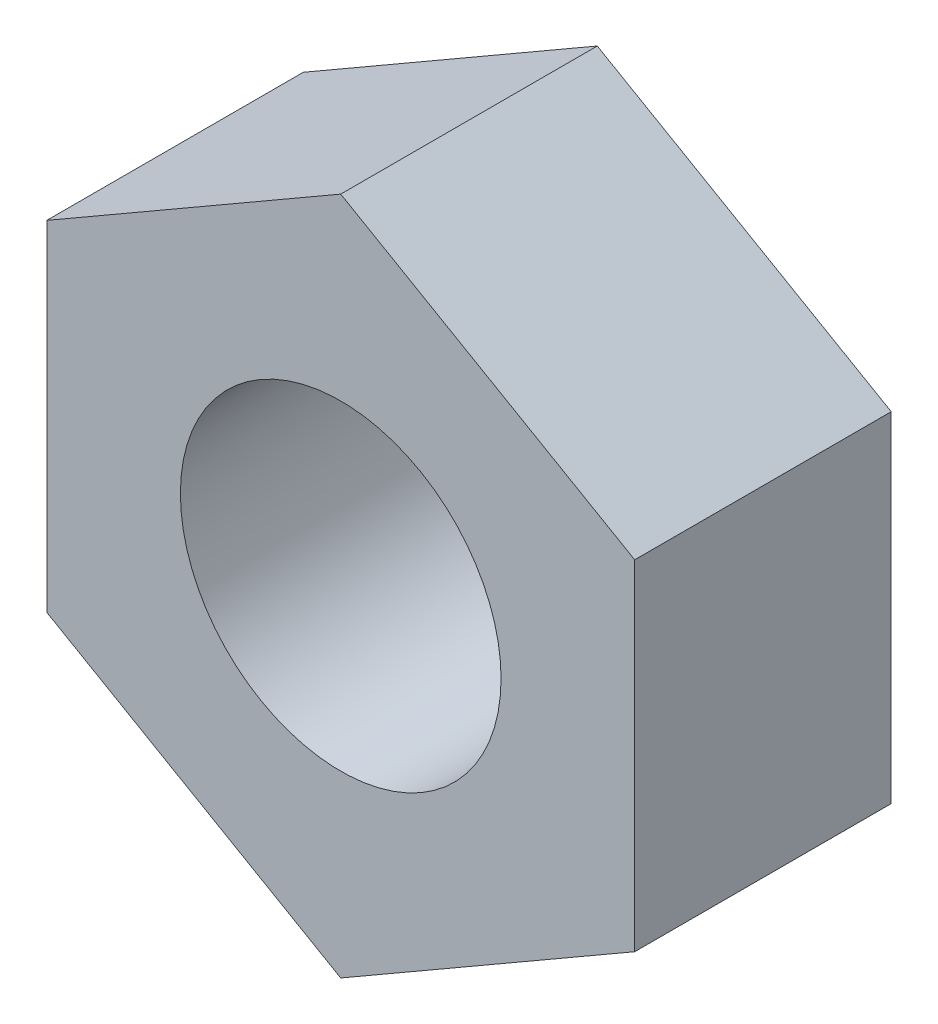
ISO-10303-21;
HEADER;
FILE_DESCRIPTION(('STEP AP214'),'2;1');
FILE_NAME('part.step','',(''),(''),'','','');
FILE_SCHEMA(('AUTOMOTIVE_DESIGN { 1 0 10303 214 1 1 1 1 }'));
ENDSEC;
DATA;
#1=APPLICATION_CONTEXT('core data for automotive mechanical design processes');
#2=APPLICATION_PROTOCOL_DEFINITION('international standard','automotive_design',2000,#1);
#3=PRODUCT_CONTEXT('',#1,'mechanical');
#4=PRODUCT('Part','Part','',(#3));
#5=PRODUCT_RELATED_PRODUCT_CATEGORY('part','',(#4));
#6=PRODUCT_DEFINITION_FORMATION('','',#4);
#7=PRODUCT_DEFINITION_CONTEXT('part definition',#1,'design');
#8=PRODUCT_DEFINITION('design','',#6,#7);
#9=PRODUCT_DEFINITION_SHAPE('','',#8);
#10=(LENGTH_UNIT() NAMED_UNIT(*) SI_UNIT(.MILLI.,.METRE.));
#11=(NAMED_UNIT(*) PLANE_ANGLE_UNIT() SI_UNIT($,.RADIAN.));
#12=(NAMED_UNIT(*) SI_UNIT($,.STERADIAN.) SOLID_ANGLE_UNIT());
#13=UNCERTAINTY_MEASURE_WITH_UNIT(LENGTH_MEASURE(1.E-05),#10,'distance_accuracy_value','');
#14=(GEOMETRIC_REPRESENTATION_CONTEXT(3) GLOBAL_UNCERTAINTY_ASSIGNED_CONTEXT((#13)) GLOBAL_UNIT_ASSIGNED_CONTEXT((#10,
#11,#12)) REPRESENTATION_CONTEXT('',''));
#15=CARTESIAN_POINT('',(0.,0.,0.));
#16=DIRECTION('',(0.,0.,1.));
#17=DIRECTION('',(1.,0.,0.));
#18=AXIS2_PLACEMENT_3D('',#15,#16,#17);
#19=CARTESIAN_POINT('',(0.,0.,1.2));
#20=DIRECTION('',(0.,0.,1.));
#21=DIRECTION('',(1.,0.,0.));
#22=AXIS2_PLACEMENT_3D('',#19,#20,#21);
#23=PLANE('',#22);
#24=DIRECTION('',(0.,1.,0.));
#25=VECTOR('',#24,1.);
#26=CARTESIAN_POINT('',(2.75,-1.58771324027147,1.2));
#27=LINE('',#26,#25);
#28=CARTESIAN_POINT('',(2.75,-1.58771324027147,1.2));
#29=VERTEX_POINT('',#28);
#30=CARTESIAN_POINT('',(2.75,1.58771324027147,1.2));
#31=VERTEX_POINT('',#30);
#32=EDGE_CURVE('E134',#29,#31,#27,.T.);
#33=ORIENTED_EDGE('',*,*,#32,.T.);
#34=DIRECTION('',(-0.866025403784438,0.5,0.));
#35=VECTOR('',#34,1.);
#36=CARTESIAN_POINT('',(2.75,1.58771324027147,1.2));
#37=LINE('',#36,#35);
#38=CARTESIAN_POINT('',(0.,3.17542648054294,1.2));
#39=VERTEX_POINT('',#38);
#40=EDGE_CURVE('E93',#31,#39,#37,.T.);
#41=ORIENTED_EDGE('',*,*,#40,.T.);
#42=DIRECTION('',(-0.866025403784438,-0.5,0.));
#43=VECTOR('',#42,1.);
#44=CARTESIAN_POINT('',(0.,3.17542648054294,1.2));
#45=LINE('',#44,#43);
#46=CARTESIAN_POINT('',(-2.75,1.58771324027147,1.2));
#47=VERTEX_POINT('',#46);
#48=EDGE_CURVE('E106',#39,#47,#45,.T.);
#49=ORIENTED_EDGE('',*,*,#48,.T.);
#50=DIRECTION('',(0.,-1.,0.));
#51=VECTOR('',#50,1.);
#52=CARTESIAN_POINT('',(-2.75,1.58771324027147,1.2));
#53=LINE('',#52,#51);
#54=CARTESIAN_POINT('',(-2.75,-1.58771324027147,1.2));
#55=VERTEX_POINT('',#54);
#56=EDGE_CURVE('E99',#47,#55,#53,.T.);
#57=ORIENTED_EDGE('',*,*,#56,.T.);
#58=DIRECTION('',(0.866025403784439,-0.5,0.));
#59=VECTOR('',#58,1.);
#60=CARTESIAN_POINT('',(-2.75,-1.58771324027147,1.2));
#61=LINE('',#60,#59);
#62=CARTESIAN_POINT('',(0.,-3.17542648054294,1.2));
#63=VERTEX_POINT('',#62);
#64=EDGE_CURVE('E101',#55,#63,#61,.T.);
#65=ORIENTED_EDGE('',*,*,#64,.T.);
#66=DIRECTION('',(0.866025403784439,0.5,0.));
#67=VECTOR('',#66,1.);
#68=CARTESIAN_POINT('',(0.,-3.17542648054294,1.2));
#69=LINE('',#68,#67);
#70=EDGE_CURVE('E57',#63,#29,#69,.T.);
#71=ORIENTED_EDGE('',*,*,#70,.T.);
#72=EDGE_LOOP('',(#33,#41,#49,#57,#65,#71));
#73=FACE_BOUND('',#72,.T.);
#74=CARTESIAN_POINT('',(0.,0.,1.2));
#75=DIRECTION('',(0.,0.,1.));
#76=DIRECTION('',(1.,0.,0.));
#77=AXIS2_PLACEMENT_3D('',#74,#75,#76);
#78=CIRCLE('',#77,1.5);
#79=CARTESIAN_POINT('',(1.5,0.,1.2));
#80=VERTEX_POINT('',#79);
#81=EDGE_CURVE('E126',#80,#80,#78,.T.);
#82=ORIENTED_EDGE('',*,*,#81,.F.);
#83=EDGE_LOOP('',(#82));
#84=FACE_BOUND('',#83,.T.);
#85=ADVANCED_FACE('F39',(#73,#84),#23,.T.);
#86=CARTESIAN_POINT('',(0.,0.,-1.2));
#87=DIRECTION('',(0.,0.,1.));
#88=DIRECTION('',(1.,0.,0.));
#89=AXIS2_PLACEMENT_3D('',#86,#87,#88);
#90=PLANE('',#89);
#91=DIRECTION('',(0.,1.,0.));
#92=VECTOR('',#91,1.);
#93=CARTESIAN_POINT('',(2.75,-1.58771324027147,-1.2));
#94=LINE('',#93,#92);
#95=CARTESIAN_POINT('',(2.75,-1.58771324027147,-1.2));
#96=VERTEX_POINT('',#95);
#97=CARTESIAN_POINT('',(2.75,1.58771324027147,-1.2));
#98=VERTEX_POINT('',#97);
#99=EDGE_CURVE('E125',#96,#98,#94,.T.);
#100=ORIENTED_EDGE('',*,*,#99,.F.);
#101=DIRECTION('',(0.866025403784439,0.5,0.));
#102=VECTOR('',#101,1.);
#103=CARTESIAN_POINT('',(0.,-3.17542648054294,-1.2));
#104=LINE('',#103,#102);
#105=CARTESIAN_POINT('',(0.,-3.17542648054294,-1.2));
#106=VERTEX_POINT('',#105);
#107=EDGE_CURVE('E82',#106,#96,#104,.T.);
#108=ORIENTED_EDGE('',*,*,#107,.F.);
#109=DIRECTION('',(0.866025403784439,-0.5,0.));
#110=VECTOR('',#109,1.);
#111=CARTESIAN_POINT('',(-2.75,-1.58771324027147,-1.2));
#112=LINE('',#111,#110);
#113=CARTESIAN_POINT('',(-2.75,-1.58771324027147,-1.2));
#114=VERTEX_POINT('',#113);
#115=EDGE_CURVE('E80',#114,#106,#112,.T.);
#116=ORIENTED_EDGE('',*,*,#115,.F.);
#117=DIRECTION('',(0.,-1.,0.));
#118=VECTOR('',#117,1.);
#119=CARTESIAN_POINT('',(-2.75,1.58771324027147,-1.2));
#120=LINE('',#119,#118);
#121=CARTESIAN_POINT('',(-2.75,1.58771324027147,-1.2));
#122=VERTEX_POINT('',#121);
#123=EDGE_CURVE('E114',#122,#114,#120,.T.);
#124=ORIENTED_EDGE('',*,*,#123,.F.);
#125=DIRECTION('',(-0.866025403784438,-0.5,0.));
#126=VECTOR('',#125,1.);
#127=CARTESIAN_POINT('',(0.,3.17542648054294,-1.2));
#128=LINE('',#127,#126);
#129=CARTESIAN_POINT('',(0.,3.17542648054294,-1.2));
#130=VERTEX_POINT('',#129);
#131=EDGE_CURVE('E127',#130,#122,#128,.T.);
#132=ORIENTED_EDGE('',*,*,#131,.F.);
#133=DIRECTION('',(-0.866025403784438,0.5,0.));
#134=VECTOR('',#133,1.);
#135=CARTESIAN_POINT('',(2.75,1.58771324027147,-1.2));
#136=LINE('',#135,#134);
#137=EDGE_CURVE('E130',#98,#130,#136,.T.);
#138=ORIENTED_EDGE('',*,*,#137,.F.);
#139=EDGE_LOOP('',(#100,#108,#116,#124,#132,#138));
#140=FACE_BOUND('',#139,.T.);
#141=CARTESIAN_POINT('',(0.,0.,-1.2));
#142=DIRECTION('',(0.,0.,1.));
#143=DIRECTION('',(1.,0.,0.));
#144=AXIS2_PLACEMENT_3D('',#141,#142,#143);
#145=CIRCLE('',#144,1.5);
#146=CARTESIAN_POINT('',(1.5,0.,-1.2));
#147=VERTEX_POINT('',#146);
#148=EDGE_CURVE('E228',#147,#147,#145,.T.);
#149=ORIENTED_EDGE('',*,*,#148,.T.);
#150=EDGE_LOOP('',(#149));
#151=FACE_BOUND('',#150,.T.);
#152=ADVANCED_FACE('F143',(#140,#151),#90,.F.);
#153=CARTESIAN_POINT('',(2.75,-1.58771324027147,1.2));
#154=DIRECTION('',(-1.,0.,0.));
#155=DIRECTION('',(0.,-1.,0.));
#156=AXIS2_PLACEMENT_3D('',#153,#154,#155);
#157=PLANE('',#156);
#158=ORIENTED_EDGE('',*,*,#99,.T.);
#159=DIRECTION('',(0.,0.,-1.));
#160=VECTOR('',#159,1.);
#161=CARTESIAN_POINT('',(2.75,1.58771324027147,1.2));
#162=LINE('',#161,#160);
#163=EDGE_CURVE('E11',#31,#98,#162,.T.);
#164=ORIENTED_EDGE('',*,*,#163,.F.);
#165=ORIENTED_EDGE('',*,*,#32,.F.);
#166=DIRECTION('',(0.,0.,-1.));
#167=VECTOR('',#166,1.);
#168=CARTESIAN_POINT('',(2.75,-1.58771324027147,1.2));
#169=LINE('',#168,#167);
#170=EDGE_CURVE('E120',#29,#96,#169,.T.);
#171=ORIENTED_EDGE('',*,*,#170,.T.);
#172=EDGE_LOOP('',(#158,#164,#165,#171));
#173=FACE_BOUND('',#172,.T.);
#174=ADVANCED_FACE('F41',(#173),#157,.F.);
#175=CARTESIAN_POINT('',(2.75,1.58771324027147,1.2));
#176=DIRECTION('',(-0.5,-0.866025403784439,0.));
#177=DIRECTION('',(0.866025403784439,-0.5,0.));
#178=AXIS2_PLACEMENT_3D('',#175,#176,#177);
#179=PLANE('',#178);
#180=ORIENTED_EDGE('',*,*,#137,.T.);
#181=DIRECTION('',(0.,0.,-1.));
#182=VECTOR('',#181,1.);
#183=CARTESIAN_POINT('',(0.,3.17542648054294,1.2));
#184=LINE('',#183,#182);
#185=EDGE_CURVE('E48',#39,#130,#184,.T.);
#186=ORIENTED_EDGE('',*,*,#185,.F.);
#187=ORIENTED_EDGE('',*,*,#40,.F.);
#188=ORIENTED_EDGE('',*,*,#163,.T.);
#189=EDGE_LOOP('',(#180,#186,#187,#188));
#190=FACE_BOUND('',#189,.T.);
#191=ADVANCED_FACE('F170',(#190),#179,.F.);
#192=CARTESIAN_POINT('',(0.,3.17542648054294,1.2));
#193=DIRECTION('',(0.5,-0.866025403784439,0.));
#194=DIRECTION('',(0.866025403784439,0.5,0.));
#195=AXIS2_PLACEMENT_3D('',#192,#193,#194);
#196=PLANE('',#195);
#197=ORIENTED_EDGE('',*,*,#131,.T.);
#198=DIRECTION('',(0.,0.,-1.));
#199=VECTOR('',#198,1.);
#200=CARTESIAN_POINT('',(-2.75,1.58771324027147,1.2));
#201=LINE('',#200,#199);
#202=EDGE_CURVE('E113',#47,#122,#201,.T.);
#203=ORIENTED_EDGE('',*,*,#202,.F.);
#204=ORIENTED_EDGE('',*,*,#48,.F.);
#205=ORIENTED_EDGE('',*,*,#185,.T.);
#206=EDGE_LOOP('',(#197,#203,#204,#205));
#207=FACE_BOUND('',#206,.T.);
#208=ADVANCED_FACE('F141',(#207),#196,.F.);
#209=CARTESIAN_POINT('',(-2.75,1.58771324027147,1.2));
#210=DIRECTION('',(1.,0.,0.));
#211=DIRECTION('',(0.,1.,0.));
#212=AXIS2_PLACEMENT_3D('',#209,#210,#211);
#213=PLANE('',#212);
#214=ORIENTED_EDGE('',*,*,#123,.T.);
#215=DIRECTION('',(0.,0.,-1.));
#216=VECTOR('',#215,1.);
#217=CARTESIAN_POINT('',(-2.75,-1.58771324027147,1.2));
#218=LINE('',#217,#216);
#219=EDGE_CURVE('E112',#55,#114,#218,.T.);
#220=ORIENTED_EDGE('',*,*,#219,.F.);
#221=ORIENTED_EDGE('',*,*,#56,.F.);
#222=ORIENTED_EDGE('',*,*,#202,.T.);
#223=EDGE_LOOP('',(#214,#220,#221,#222));
#224=FACE_BOUND('',#223,.T.);
#225=ADVANCED_FACE('F115',(#224),#213,.F.);
#226=CARTESIAN_POINT('',(-2.75,-1.58771324027147,1.2));
#227=DIRECTION('',(0.5,0.866025403784439,0.));
#228=DIRECTION('',(-0.866025403784439,0.5,0.));
#229=AXIS2_PLACEMENT_3D('',#226,#227,#228);
#230=PLANE('',#229);
#231=ORIENTED_EDGE('',*,*,#115,.T.);
#232=DIRECTION('',(0.,0.,-1.));
#233=VECTOR('',#232,1.);
#234=CARTESIAN_POINT('',(0.,-3.17542648054294,1.2));
#235=LINE('',#234,#233);
#236=EDGE_CURVE('E116',#63,#106,#235,.T.);
#237=ORIENTED_EDGE('',*,*,#236,.F.);
#238=ORIENTED_EDGE('',*,*,#64,.F.);
#239=ORIENTED_EDGE('',*,*,#219,.T.);
#240=EDGE_LOOP('',(#231,#237,#238,#239));
#241=FACE_BOUND('',#240,.T.);
#242=ADVANCED_FACE('F119',(#241),#230,.F.);
#243=CARTESIAN_POINT('',(0.,-3.17542648054294,1.2));
#244=DIRECTION('',(-0.5,0.866025403784439,0.));
#245=DIRECTION('',(-0.866025403784439,-0.5,0.));
#246=AXIS2_PLACEMENT_3D('',#243,#244,#245);
#247=PLANE('',#246);
#248=ORIENTED_EDGE('',*,*,#107,.T.);
#249=ORIENTED_EDGE('',*,*,#170,.F.);
#250=ORIENTED_EDGE('',*,*,#70,.F.);
#251=ORIENTED_EDGE('',*,*,#236,.T.);
#252=EDGE_LOOP('',(#248,#249,#250,#251));
#253=FACE_BOUND('',#252,.T.);
#254=ADVANCED_FACE('F146',(#253),#247,.F.);
#255=CARTESIAN_POINT('',(0.,0.,1.2));
#256=DIRECTION('',(0.,0.,-1.));
#257=DIRECTION('',(-1.,0.,0.));
#258=AXIS2_PLACEMENT_3D('',#255,#256,#257);
#259=CYLINDRICAL_SURFACE('',#258,1.5);
#260=ORIENTED_EDGE('',*,*,#81,.T.);
#261=EDGE_LOOP('',(#260));
#262=FACE_BOUND('',#261,.T.);
#263=ORIENTED_EDGE('',*,*,#148,.F.);
#264=EDGE_LOOP('',(#263));
#265=FACE_BOUND('',#264,.T.);
#266=ADVANCED_FACE('F151',(#262,#265),#259,.F.);
#267=CLOSED_SHELL('',(#85,#152,#174,#191,#208,#225,#242,#254,#266));
#268=MANIFOLD_SOLID_BREP('B2',#267);
#269=ADVANCED_BREP_SHAPE_REPRESENTATION('',(#18,#268),#14);
#270=SHAPE_DEFINITION_REPRESENTATION(#9,#269);
ENDSEC;
END-ISO-10303-21;
